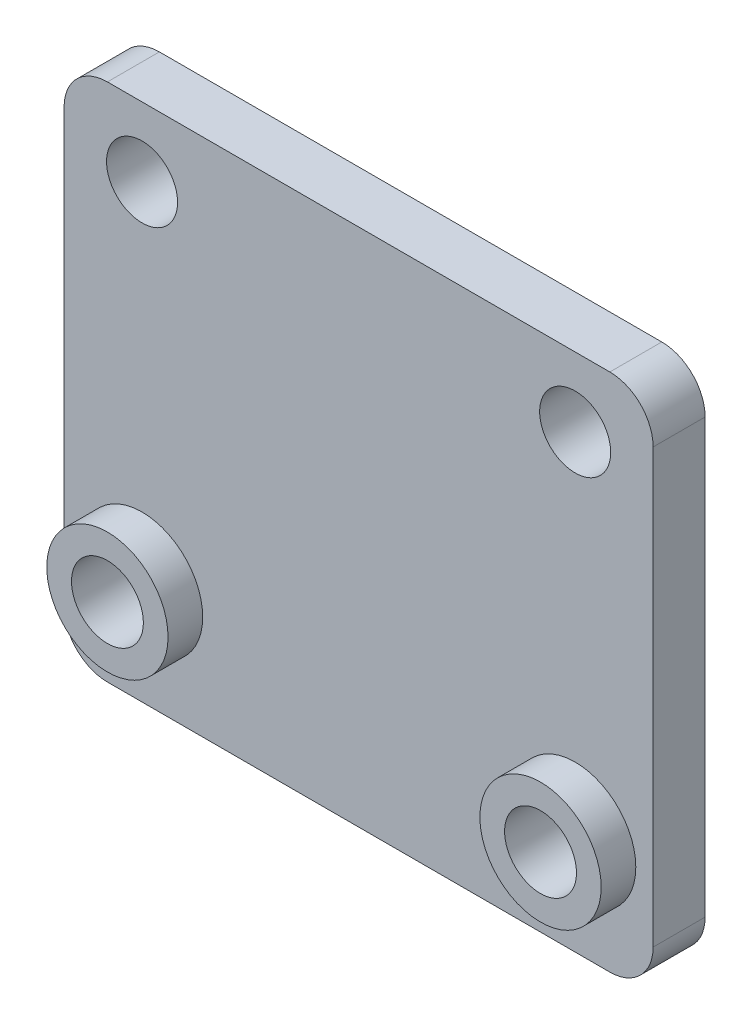
ISO-10303-21;
HEADER;
FILE_DESCRIPTION(('STEP AP214'),'2;1');
FILE_NAME('part.step','',(''),(''),'','','');
FILE_SCHEMA(('AUTOMOTIVE_DESIGN { 1 0 10303 214 1 1 1 1 }'));
ENDSEC;
DATA;
#1=APPLICATION_CONTEXT('core data for automotive mechanical design processes');
#2=APPLICATION_PROTOCOL_DEFINITION('international standard','automotive_design',2000,#1);
#3=PRODUCT_CONTEXT('',#1,'mechanical');
#4=PRODUCT('Part','Part','',(#3));
#5=PRODUCT_RELATED_PRODUCT_CATEGORY('part','',(#4));
#6=PRODUCT_DEFINITION_FORMATION('','',#4);
#7=PRODUCT_DEFINITION_CONTEXT('part definition',#1,'design');
#8=PRODUCT_DEFINITION('design','',#6,#7);
#9=PRODUCT_DEFINITION_SHAPE('','',#8);
#10=(LENGTH_UNIT() NAMED_UNIT(*) SI_UNIT(.MILLI.,.METRE.));
#11=(NAMED_UNIT(*) PLANE_ANGLE_UNIT() SI_UNIT($,.RADIAN.));
#12=(NAMED_UNIT(*) SI_UNIT($,.STERADIAN.) SOLID_ANGLE_UNIT());
#13=UNCERTAINTY_MEASURE_WITH_UNIT(LENGTH_MEASURE(1.E-05),#10,'distance_accuracy_value','');
#14=(GEOMETRIC_REPRESENTATION_CONTEXT(3) GLOBAL_UNCERTAINTY_ASSIGNED_CONTEXT((#13)) GLOBAL_UNIT_ASSIGNED_CONTEXT((#10,
#11,#12)) REPRESENTATION_CONTEXT('',''));
#15=CARTESIAN_POINT('',(0.,0.,0.));
#16=DIRECTION('',(0.,0.,1.));
#17=DIRECTION('',(1.,0.,0.));
#18=AXIS2_PLACEMENT_3D('',#15,#16,#17);
#19=CARTESIAN_POINT('',(34.,0.,136.));
#20=DIRECTION('',(-1.,0.,0.));
#21=DIRECTION('',(0.,-1.,0.));
#22=AXIS2_PLACEMENT_3D('',#19,#20,#21);
#23=PLANE('',#22);
#24=DIRECTION('',(0.,-1.,0.));
#25=VECTOR('',#24,1.);
#26=CARTESIAN_POINT('',(34.,0.,130.));
#27=LINE('',#26,#25);
#28=CARTESIAN_POINT('',(34.,25.,130.));
#29=VERTEX_POINT('',#28);
#30=CARTESIAN_POINT('',(34.,-25.,130.));
#31=VERTEX_POINT('',#30);
#32=EDGE_CURVE('E135',#29,#31,#27,.T.);
#33=ORIENTED_EDGE('',*,*,#32,.F.);
#34=DIRECTION('',(0.,0.,-1.));
#35=VECTOR('',#34,1.);
#36=CARTESIAN_POINT('',(34.,25.,136.));
#37=LINE('',#36,#35);
#38=CARTESIAN_POINT('',(34.,25.,136.));
#39=VERTEX_POINT('',#38);
#40=EDGE_CURVE('E109',#29,#39,#37,.F.);
#41=ORIENTED_EDGE('',*,*,#40,.T.);
#42=DIRECTION('',(0.,-1.,0.));
#43=VECTOR('',#42,1.);
#44=CARTESIAN_POINT('',(34.,0.,136.));
#45=LINE('',#44,#43);
#46=CARTESIAN_POINT('',(34.,-25.,136.));
#47=VERTEX_POINT('',#46);
#48=EDGE_CURVE('E160',#39,#47,#45,.T.);
#49=ORIENTED_EDGE('',*,*,#48,.T.);
#50=DIRECTION('',(0.,0.,-1.));
#51=VECTOR('',#50,1.);
#52=CARTESIAN_POINT('',(34.,-25.,136.));
#53=LINE('',#52,#51);
#54=EDGE_CURVE('E115',#47,#31,#53,.T.);
#55=ORIENTED_EDGE('',*,*,#54,.T.);
#56=EDGE_LOOP('',(#33,#41,#49,#55));
#57=FACE_BOUND('',#56,.T.);
#58=ADVANCED_FACE('F16',(#57),#23,.F.);
#59=CARTESIAN_POINT('',(0.,30.,136.));
#60=DIRECTION('',(0.,1.,0.));
#61=DIRECTION('',(-1.,0.,0.));
#62=AXIS2_PLACEMENT_3D('',#59,#60,#61);
#63=PLANE('',#62);
#64=DIRECTION('',(-1.,0.,0.));
#65=VECTOR('',#64,1.);
#66=CARTESIAN_POINT('',(0.,30.,136.));
#67=LINE('',#66,#65);
#68=CARTESIAN_POINT('',(29.,30.,136.));
#69=VERTEX_POINT('',#68);
#70=CARTESIAN_POINT('',(-29.,30.,136.));
#71=VERTEX_POINT('',#70);
#72=EDGE_CURVE('E125',#69,#71,#67,.T.);
#73=ORIENTED_EDGE('',*,*,#72,.F.);
#74=DIRECTION('',(0.,0.,-1.));
#75=VECTOR('',#74,1.);
#76=CARTESIAN_POINT('',(29.,30.,130.));
#77=LINE('',#76,#75);
#78=CARTESIAN_POINT('',(29.,30.,130.));
#79=VERTEX_POINT('',#78);
#80=EDGE_CURVE('E108',#69,#79,#77,.T.);
#81=ORIENTED_EDGE('',*,*,#80,.T.);
#82=DIRECTION('',(-1.,0.,0.));
#83=VECTOR('',#82,1.);
#84=CARTESIAN_POINT('',(0.,30.,130.));
#85=LINE('',#84,#83);
#86=CARTESIAN_POINT('',(-29.,30.,130.));
#87=VERTEX_POINT('',#86);
#88=EDGE_CURVE('E122',#79,#87,#85,.T.);
#89=ORIENTED_EDGE('',*,*,#88,.T.);
#90=DIRECTION('',(0.,0.,-1.));
#91=VECTOR('',#90,1.);
#92=CARTESIAN_POINT('',(-29.,30.,136.));
#93=LINE('',#92,#91);
#94=EDGE_CURVE('E128',#87,#71,#93,.F.);
#95=ORIENTED_EDGE('',*,*,#94,.T.);
#96=EDGE_LOOP('',(#73,#81,#89,#95));
#97=FACE_BOUND('',#96,.T.);
#98=ADVANCED_FACE('F121',(#97),#63,.T.);
#99=CARTESIAN_POINT('',(-34.,0.,136.));
#100=DIRECTION('',(-1.,0.,0.));
#101=DIRECTION('',(0.,-1.,0.));
#102=AXIS2_PLACEMENT_3D('',#99,#100,#101);
#103=PLANE('',#102);
#104=DIRECTION('',(0.,-1.,0.));
#105=VECTOR('',#104,1.);
#106=CARTESIAN_POINT('',(-34.,0.,130.));
#107=LINE('',#106,#105);
#108=CARTESIAN_POINT('',(-34.,25.,130.));
#109=VERTEX_POINT('',#108);
#110=CARTESIAN_POINT('',(-34.,-25.,130.));
#111=VERTEX_POINT('',#110);
#112=EDGE_CURVE('E134',#109,#111,#107,.T.);
#113=ORIENTED_EDGE('',*,*,#112,.T.);
#114=DIRECTION('',(0.,0.,-1.));
#115=VECTOR('',#114,1.);
#116=CARTESIAN_POINT('',(-34.,-25.,136.));
#117=LINE('',#116,#115);
#118=CARTESIAN_POINT('',(-34.,-25.,136.));
#119=VERTEX_POINT('',#118);
#120=EDGE_CURVE('E10',#111,#119,#117,.F.);
#121=ORIENTED_EDGE('',*,*,#120,.T.);
#122=DIRECTION('',(0.,-1.,0.));
#123=VECTOR('',#122,1.);
#124=CARTESIAN_POINT('',(-34.,0.,136.));
#125=LINE('',#124,#123);
#126=CARTESIAN_POINT('',(-34.,25.,136.));
#127=VERTEX_POINT('',#126);
#128=EDGE_CURVE('E203',#127,#119,#125,.T.);
#129=ORIENTED_EDGE('',*,*,#128,.F.);
#130=DIRECTION('',(0.,0.,-1.));
#131=VECTOR('',#130,1.);
#132=CARTESIAN_POINT('',(-34.,25.,136.));
#133=LINE('',#132,#131);
#134=EDGE_CURVE('E25',#127,#109,#133,.T.);
#135=ORIENTED_EDGE('',*,*,#134,.T.);
#136=EDGE_LOOP('',(#113,#121,#129,#135));
#137=FACE_BOUND('',#136,.T.);
#138=ADVANCED_FACE('F201',(#137),#103,.T.);
#139=CARTESIAN_POINT('',(-25.,22.,136.));
#140=DIRECTION('',(0.,0.,-1.));
#141=DIRECTION('',(1.,0.,0.));
#142=AXIS2_PLACEMENT_3D('',#139,#140,#141);
#143=CYLINDRICAL_SURFACE('',#142,4.1);
#144=CARTESIAN_POINT('',(-25.,22.,136.));
#145=DIRECTION('',(0.,0.,1.));
#146=DIRECTION('',(1.,0.,0.));
#147=AXIS2_PLACEMENT_3D('',#144,#145,#146);
#148=CIRCLE('',#147,4.1);
#149=CARTESIAN_POINT('',(-20.9,22.,136.));
#150=VERTEX_POINT('',#149);
#151=EDGE_CURVE('E218',#150,#150,#148,.T.);
#152=ORIENTED_EDGE('',*,*,#151,.T.);
#153=EDGE_LOOP('',(#152));
#154=FACE_BOUND('',#153,.T.);
#155=CARTESIAN_POINT('',(-25.,22.,130.));
#156=DIRECTION('',(0.,0.,1.));
#157=DIRECTION('',(1.,0.,0.));
#158=AXIS2_PLACEMENT_3D('',#155,#156,#157);
#159=CIRCLE('',#158,4.1);
#160=CARTESIAN_POINT('',(-20.9,22.,130.));
#161=VERTEX_POINT('',#160);
#162=EDGE_CURVE('E156',#161,#161,#159,.T.);
#163=ORIENTED_EDGE('',*,*,#162,.F.);
#164=EDGE_LOOP('',(#163));
#165=FACE_BOUND('',#164,.T.);
#166=ADVANCED_FACE('F368',(#154,#165),#143,.F.);
#167=CARTESIAN_POINT('',(25.,22.,136.));
#168=DIRECTION('',(0.,0.,-1.));
#169=DIRECTION('',(1.,0.,0.));
#170=AXIS2_PLACEMENT_3D('',#167,#168,#169);
#171=CYLINDRICAL_SURFACE('',#170,4.1);
#172=CARTESIAN_POINT('',(25.,22.,136.));
#173=DIRECTION('',(0.,0.,1.));
#174=DIRECTION('',(1.,0.,0.));
#175=AXIS2_PLACEMENT_3D('',#172,#173,#174);
#176=CIRCLE('',#175,4.1);
#177=CARTESIAN_POINT('',(29.1,22.,136.));
#178=VERTEX_POINT('',#177);
#179=EDGE_CURVE('E213',#178,#178,#176,.T.);
#180=ORIENTED_EDGE('',*,*,#179,.T.);
#181=EDGE_LOOP('',(#180));
#182=FACE_BOUND('',#181,.T.);
#183=CARTESIAN_POINT('',(25.,22.,130.));
#184=DIRECTION('',(0.,0.,1.));
#185=DIRECTION('',(1.,0.,0.));
#186=AXIS2_PLACEMENT_3D('',#183,#184,#185);
#187=CIRCLE('',#186,4.1);
#188=CARTESIAN_POINT('',(29.1,22.,130.));
#189=VERTEX_POINT('',#188);
#190=EDGE_CURVE('E152',#189,#189,#187,.T.);
#191=ORIENTED_EDGE('',*,*,#190,.F.);
#192=EDGE_LOOP('',(#191));
#193=FACE_BOUND('',#192,.T.);
#194=ADVANCED_FACE('F362',(#182,#193),#171,.F.);
#195=CARTESIAN_POINT('',(0.,-30.,136.));
#196=DIRECTION('',(0.,1.,0.));
#197=DIRECTION('',(-1.,0.,0.));
#198=AXIS2_PLACEMENT_3D('',#195,#196,#197);
#199=PLANE('',#198);
#200=DIRECTION('',(-1.,0.,0.));
#201=VECTOR('',#200,1.);
#202=CARTESIAN_POINT('',(0.,-30.,136.));
#203=LINE('',#202,#201);
#204=CARTESIAN_POINT('',(29.,-30.,136.));
#205=VERTEX_POINT('',#204);
#206=CARTESIAN_POINT('',(-29.,-30.,136.));
#207=VERTEX_POINT('',#206);
#208=EDGE_CURVE('E210',#205,#207,#203,.T.);
#209=ORIENTED_EDGE('',*,*,#208,.T.);
#210=DIRECTION('',(0.,0.,-1.));
#211=VECTOR('',#210,1.);
#212=CARTESIAN_POINT('',(-29.,-30.,130.));
#213=LINE('',#212,#211);
#214=CARTESIAN_POINT('',(-29.,-30.,130.));
#215=VERTEX_POINT('',#214);
#216=EDGE_CURVE('E192',#207,#215,#213,.T.);
#217=ORIENTED_EDGE('',*,*,#216,.T.);
#218=DIRECTION('',(-1.,0.,0.));
#219=VECTOR('',#218,1.);
#220=CARTESIAN_POINT('',(0.,-30.,130.));
#221=LINE('',#220,#219);
#222=CARTESIAN_POINT('',(29.,-30.,130.));
#223=VERTEX_POINT('',#222);
#224=EDGE_CURVE('E142',#223,#215,#221,.T.);
#225=ORIENTED_EDGE('',*,*,#224,.F.);
#226=DIRECTION('',(0.,0.,-1.));
#227=VECTOR('',#226,1.);
#228=CARTESIAN_POINT('',(29.,-30.,136.));
#229=LINE('',#228,#227);
#230=EDGE_CURVE('E48',#223,#205,#229,.F.);
#231=ORIENTED_EDGE('',*,*,#230,.T.);
#232=EDGE_LOOP('',(#209,#217,#225,#231));
#233=FACE_BOUND('',#232,.T.);
#234=ADVANCED_FACE('F209',(#233),#199,.F.);
#235=CARTESIAN_POINT('',(0.,0.,136.));
#236=DIRECTION('',(0.,0.,-1.));
#237=DIRECTION('',(1.,0.,0.));
#238=AXIS2_PLACEMENT_3D('',#235,#236,#237);
#239=PLANE('',#238);
#240=CARTESIAN_POINT('',(-25.,-18.,136.));
#241=DIRECTION('',(0.,0.,1.));
#242=DIRECTION('',(1.,0.,0.));
#243=AXIS2_PLACEMENT_3D('',#240,#241,#242);
#244=CIRCLE('',#243,7.);
#245=CARTESIAN_POINT('',(-18.,-18.,136.));
#246=VERTEX_POINT('',#245);
#247=EDGE_CURVE('E161',#246,#246,#244,.F.);
#248=ORIENTED_EDGE('',*,*,#247,.T.);
#249=EDGE_LOOP('',(#248));
#250=FACE_BOUND('',#249,.T.);
#251=CARTESIAN_POINT('',(25.,-18.,136.));
#252=DIRECTION('',(0.,0.,-1.));
#253=DIRECTION('',(1.,0.,0.));
#254=AXIS2_PLACEMENT_3D('',#251,#252,#253);
#255=CIRCLE('',#254,7.);
#256=CARTESIAN_POINT('',(32.,-18.,136.));
#257=VERTEX_POINT('',#256);
#258=EDGE_CURVE('E165',#257,#257,#255,.T.);
#259=ORIENTED_EDGE('',*,*,#258,.T.);
#260=EDGE_LOOP('',(#259));
#261=FACE_BOUND('',#260,.T.);
#262=ORIENTED_EDGE('',*,*,#48,.F.);
#263=CARTESIAN_POINT('',(29.,25.,136.));
#264=DIRECTION('',(0.,0.,-1.));
#265=DIRECTION('',(-1.,0.,0.));
#266=AXIS2_PLACEMENT_3D('',#263,#264,#265);
#267=CIRCLE('',#266,5.);
#268=EDGE_CURVE('E187',#39,#69,#267,.F.);
#269=ORIENTED_EDGE('',*,*,#268,.T.);
#270=ORIENTED_EDGE('',*,*,#72,.T.);
#271=CARTESIAN_POINT('',(-29.,25.,136.));
#272=DIRECTION('',(0.,0.,-1.));
#273=DIRECTION('',(-1.,0.,0.));
#274=AXIS2_PLACEMENT_3D('',#271,#272,#273);
#275=CIRCLE('',#274,5.);
#276=EDGE_CURVE('E180',#71,#127,#275,.F.);
#277=ORIENTED_EDGE('',*,*,#276,.T.);
#278=ORIENTED_EDGE('',*,*,#128,.T.);
#279=CARTESIAN_POINT('',(-29.,-25.,136.));
#280=DIRECTION('',(0.,0.,-1.));
#281=DIRECTION('',(-1.,0.,0.));
#282=AXIS2_PLACEMENT_3D('',#279,#280,#281);
#283=CIRCLE('',#282,5.);
#284=EDGE_CURVE('E37',#119,#207,#283,.F.);
#285=ORIENTED_EDGE('',*,*,#284,.T.);
#286=ORIENTED_EDGE('',*,*,#208,.F.);
#287=CARTESIAN_POINT('',(29.,-25.,136.));
#288=DIRECTION('',(0.,0.,-1.));
#289=DIRECTION('',(-1.,0.,0.));
#290=AXIS2_PLACEMENT_3D('',#287,#288,#289);
#291=CIRCLE('',#290,5.);
#292=EDGE_CURVE('E183',#205,#47,#291,.F.);
#293=ORIENTED_EDGE('',*,*,#292,.T.);
#294=EDGE_LOOP('',(#262,#269,#270,#277,#278,#285,#286,#293));
#295=FACE_BOUND('',#294,.T.);
#296=ORIENTED_EDGE('',*,*,#179,.F.);
#297=EDGE_LOOP('',(#296));
#298=FACE_BOUND('',#297,.T.);
#299=ORIENTED_EDGE('',*,*,#151,.F.);
#300=EDGE_LOOP('',(#299));
#301=FACE_BOUND('',#300,.T.);
#302=ADVANCED_FACE('F250',(#250,#261,#295,#298,#301),#239,.F.);
#303=CARTESIAN_POINT('',(0.,0.,130.));
#304=DIRECTION('',(0.,0.,-1.));
#305=DIRECTION('',(1.,0.,0.));
#306=AXIS2_PLACEMENT_3D('',#303,#304,#305);
#307=PLANE('',#306);
#308=ORIENTED_EDGE('',*,*,#88,.F.);
#309=CARTESIAN_POINT('',(29.,25.,130.));
#310=DIRECTION('',(0.,0.,-1.));
#311=DIRECTION('',(-1.,0.,0.));
#312=AXIS2_PLACEMENT_3D('',#309,#310,#311);
#313=CIRCLE('',#312,5.);
#314=EDGE_CURVE('E104',#79,#29,#313,.T.);
#315=ORIENTED_EDGE('',*,*,#314,.T.);
#316=ORIENTED_EDGE('',*,*,#32,.T.);
#317=CARTESIAN_POINT('',(29.,-25.,130.));
#318=DIRECTION('',(0.,0.,-1.));
#319=DIRECTION('',(-1.,0.,0.));
#320=AXIS2_PLACEMENT_3D('',#317,#318,#319);
#321=CIRCLE('',#320,5.);
#322=EDGE_CURVE('E170',#31,#223,#321,.T.);
#323=ORIENTED_EDGE('',*,*,#322,.T.);
#324=ORIENTED_EDGE('',*,*,#224,.T.);
#325=CARTESIAN_POINT('',(-29.,-25.,130.));
#326=DIRECTION('',(0.,0.,-1.));
#327=DIRECTION('',(-1.,0.,0.));
#328=AXIS2_PLACEMENT_3D('',#325,#326,#327);
#329=CIRCLE('',#328,5.);
#330=EDGE_CURVE('E116',#215,#111,#329,.T.);
#331=ORIENTED_EDGE('',*,*,#330,.T.);
#332=ORIENTED_EDGE('',*,*,#112,.F.);
#333=CARTESIAN_POINT('',(-29.,25.,130.));
#334=DIRECTION('',(0.,0.,-1.));
#335=DIRECTION('',(-1.,0.,0.));
#336=AXIS2_PLACEMENT_3D('',#333,#334,#335);
#337=CIRCLE('',#336,5.);
#338=EDGE_CURVE('E127',#109,#87,#337,.T.);
#339=ORIENTED_EDGE('',*,*,#338,.T.);
#340=EDGE_LOOP('',(#308,#315,#316,#323,#324,#331,#332,#339));
#341=FACE_BOUND('',#340,.T.);
#342=ORIENTED_EDGE('',*,*,#190,.T.);
#343=EDGE_LOOP('',(#342));
#344=FACE_BOUND('',#343,.T.);
#345=ORIENTED_EDGE('',*,*,#162,.T.);
#346=EDGE_LOOP('',(#345));
#347=FACE_BOUND('',#346,.T.);
#348=ADVANCED_FACE('F130',(#341,#344,#347),#307,.T.);
#349=CARTESIAN_POINT('',(25.,-18.,140.));
#350=DIRECTION('',(0.,0.,-1.));
#351=DIRECTION('',(1.,0.,0.));
#352=AXIS2_PLACEMENT_3D('',#349,#350,#351);
#353=CYLINDRICAL_SURFACE('',#352,7.);
#354=CARTESIAN_POINT('',(25.,-18.,140.));
#355=DIRECTION('',(0.,0.,-1.));
#356=DIRECTION('',(1.,0.,0.));
#357=AXIS2_PLACEMENT_3D('',#354,#355,#356);
#358=CIRCLE('',#357,7.);
#359=CARTESIAN_POINT('',(32.,-18.,140.));
#360=VERTEX_POINT('',#359);
#361=EDGE_CURVE('E238',#360,#360,#358,.T.);
#362=ORIENTED_EDGE('',*,*,#361,.T.);
#363=EDGE_LOOP('',(#362));
#364=FACE_BOUND('',#363,.T.);
#365=ORIENTED_EDGE('',*,*,#258,.F.);
#366=EDGE_LOOP('',(#365));
#367=FACE_BOUND('',#366,.T.);
#368=ADVANCED_FACE('F338',(#364,#367),#353,.T.);
#369=CARTESIAN_POINT('',(0.,0.,140.));
#370=DIRECTION('',(0.,0.,1.));
#371=DIRECTION('',(1.,0.,0.));
#372=AXIS2_PLACEMENT_3D('',#369,#370,#371);
#373=PLANE('',#372);
#374=CARTESIAN_POINT('',(25.,-18.,140.));
#375=DIRECTION('',(0.,0.,1.));
#376=DIRECTION('',(1.,0.,0.));
#377=AXIS2_PLACEMENT_3D('',#374,#375,#376);
#378=CIRCLE('',#377,4.15);
#379=CARTESIAN_POINT('',(29.15,-18.,140.));
#380=VERTEX_POINT('',#379);
#381=EDGE_CURVE('E396',#380,#380,#378,.T.);
#382=ORIENTED_EDGE('',*,*,#381,.F.);
#383=EDGE_LOOP('',(#382));
#384=FACE_BOUND('',#383,.T.);
#385=ORIENTED_EDGE('',*,*,#361,.F.);
#386=EDGE_LOOP('',(#385));
#387=FACE_BOUND('',#386,.T.);
#388=ADVANCED_FACE('F331',(#384,#387),#373,.T.);
#389=CARTESIAN_POINT('',(0.,-18.,132.));
#390=DIRECTION('',(0.,0.,1.));
#391=DIRECTION('',(1.,0.,0.));
#392=AXIS2_PLACEMENT_3D('',#389,#390,#391);
#393=PLANE('',#392);
#394=CARTESIAN_POINT('',(25.,-18.,132.));
#395=DIRECTION('',(0.,0.,1.));
#396=DIRECTION('',(-1.,0.,0.));
#397=AXIS2_PLACEMENT_3D('',#394,#395,#396);
#398=CIRCLE('',#397,4.15);
#399=CARTESIAN_POINT('',(20.85,-18.,132.));
#400=VERTEX_POINT('',#399);
#401=EDGE_CURVE('E145',#400,#400,#398,.T.);
#402=ORIENTED_EDGE('',*,*,#401,.T.);
#403=EDGE_LOOP('',(#402));
#404=FACE_BOUND('',#403,.T.);
#405=ADVANCED_FACE('F325',(#404),#393,.T.);
#406=CARTESIAN_POINT('',(25.,-18.,157.));
#407=DIRECTION('',(0.,0.,-1.));
#408=DIRECTION('',(1.,0.,0.));
#409=AXIS2_PLACEMENT_3D('',#406,#407,#408);
#410=CYLINDRICAL_SURFACE('',#409,4.15);
#411=ORIENTED_EDGE('',*,*,#401,.F.);
#412=EDGE_LOOP('',(#411));
#413=FACE_BOUND('',#412,.T.);
#414=ORIENTED_EDGE('',*,*,#381,.T.);
#415=EDGE_LOOP('',(#414));
#416=FACE_BOUND('',#415,.T.);
#417=ADVANCED_FACE('F318',(#413,#416),#410,.F.);
#418=CARTESIAN_POINT('',(-25.,-18.,140.));
#419=DIRECTION('',(0.,0.,-1.));
#420=DIRECTION('',(1.,0.,0.));
#421=AXIS2_PLACEMENT_3D('',#418,#419,#420);
#422=CYLINDRICAL_SURFACE('',#421,7.);
#423=CARTESIAN_POINT('',(-25.,-18.,140.));
#424=DIRECTION('',(0.,0.,-1.));
#425=DIRECTION('',(1.,0.,0.));
#426=AXIS2_PLACEMENT_3D('',#423,#424,#425);
#427=CIRCLE('',#426,7.);
#428=CARTESIAN_POINT('',(-18.,-18.,140.));
#429=VERTEX_POINT('',#428);
#430=EDGE_CURVE('E406',#429,#429,#427,.T.);
#431=ORIENTED_EDGE('',*,*,#430,.T.);
#432=EDGE_LOOP('',(#431));
#433=FACE_BOUND('',#432,.T.);
#434=ORIENTED_EDGE('',*,*,#247,.F.);
#435=EDGE_LOOP('',(#434));
#436=FACE_BOUND('',#435,.T.);
#437=ADVANCED_FACE('F311',(#433,#436),#422,.T.);
#438=CARTESIAN_POINT('',(0.,0.,140.));
#439=DIRECTION('',(0.,0.,1.));
#440=DIRECTION('',(1.,0.,0.));
#441=AXIS2_PLACEMENT_3D('',#438,#439,#440);
#442=PLANE('',#441);
#443=CARTESIAN_POINT('',(-25.,-18.,140.));
#444=DIRECTION('',(0.,0.,1.));
#445=DIRECTION('',(1.,0.,0.));
#446=AXIS2_PLACEMENT_3D('',#443,#444,#445);
#447=CIRCLE('',#446,4.15);
#448=CARTESIAN_POINT('',(-20.85,-18.,140.));
#449=VERTEX_POINT('',#448);
#450=EDGE_CURVE('E401',#449,#449,#447,.T.);
#451=ORIENTED_EDGE('',*,*,#450,.F.);
#452=EDGE_LOOP('',(#451));
#453=FACE_BOUND('',#452,.T.);
#454=ORIENTED_EDGE('',*,*,#430,.F.);
#455=EDGE_LOOP('',(#454));
#456=FACE_BOUND('',#455,.T.);
#457=ADVANCED_FACE('F302',(#453,#456),#442,.T.);
#458=CARTESIAN_POINT('',(0.,-18.,132.));
#459=DIRECTION('',(0.,0.,1.));
#460=DIRECTION('',(1.,0.,0.));
#461=AXIS2_PLACEMENT_3D('',#458,#459,#460);
#462=PLANE('',#461);
#463=CARTESIAN_POINT('',(-25.,-18.,132.));
#464=DIRECTION('',(0.,0.,1.));
#465=DIRECTION('',(-1.,0.,0.));
#466=AXIS2_PLACEMENT_3D('',#463,#464,#465);
#467=CIRCLE('',#466,4.15);
#468=CARTESIAN_POINT('',(-29.15,-18.,132.));
#469=VERTEX_POINT('',#468);
#470=EDGE_CURVE('E242',#469,#469,#467,.T.);
#471=ORIENTED_EDGE('',*,*,#470,.T.);
#472=EDGE_LOOP('',(#471));
#473=FACE_BOUND('',#472,.T.);
#474=ADVANCED_FACE('F294',(#473),#462,.T.);
#475=CARTESIAN_POINT('',(-25.,-18.,157.));
#476=DIRECTION('',(0.,0.,-1.));
#477=DIRECTION('',(1.,0.,0.));
#478=AXIS2_PLACEMENT_3D('',#475,#476,#477);
#479=CYLINDRICAL_SURFACE('',#478,4.15);
#480=ORIENTED_EDGE('',*,*,#470,.F.);
#481=EDGE_LOOP('',(#480));
#482=FACE_BOUND('',#481,.T.);
#483=ORIENTED_EDGE('',*,*,#450,.T.);
#484=EDGE_LOOP('',(#483));
#485=FACE_BOUND('',#484,.T.);
#486=ADVANCED_FACE('F270',(#482,#485),#479,.F.);
#487=CARTESIAN_POINT('',(29.,25.,136.));
#488=DIRECTION('',(0.,0.,1.));
#489=DIRECTION('',(1.,0.,0.));
#490=AXIS2_PLACEMENT_3D('',#487,#488,#489);
#491=CYLINDRICAL_SURFACE('',#490,5.);
#492=ORIENTED_EDGE('',*,*,#268,.F.);
#493=ORIENTED_EDGE('',*,*,#40,.F.);
#494=ORIENTED_EDGE('',*,*,#314,.F.);
#495=ORIENTED_EDGE('',*,*,#80,.F.);
#496=EDGE_LOOP('',(#492,#493,#494,#495));
#497=FACE_BOUND('',#496,.T.);
#498=ADVANCED_FACE('F107',(#497),#491,.T.);
#499=CARTESIAN_POINT('',(-29.,-25.,136.));
#500=DIRECTION('',(0.,0.,1.));
#501=DIRECTION('',(1.,0.,0.));
#502=AXIS2_PLACEMENT_3D('',#499,#500,#501);
#503=CYLINDRICAL_SURFACE('',#502,5.);
#504=ORIENTED_EDGE('',*,*,#284,.F.);
#505=ORIENTED_EDGE('',*,*,#120,.F.);
#506=ORIENTED_EDGE('',*,*,#330,.F.);
#507=ORIENTED_EDGE('',*,*,#216,.F.);
#508=EDGE_LOOP('',(#504,#505,#506,#507));
#509=FACE_BOUND('',#508,.T.);
#510=ADVANCED_FACE('F208',(#509),#503,.T.);
#511=CARTESIAN_POINT('',(29.,-25.,136.));
#512=DIRECTION('',(0.,0.,-1.));
#513=DIRECTION('',(-1.,0.,0.));
#514=AXIS2_PLACEMENT_3D('',#511,#512,#513);
#515=CYLINDRICAL_SURFACE('',#514,5.);
#516=ORIENTED_EDGE('',*,*,#292,.F.);
#517=ORIENTED_EDGE('',*,*,#230,.F.);
#518=ORIENTED_EDGE('',*,*,#322,.F.);
#519=ORIENTED_EDGE('',*,*,#54,.F.);
#520=EDGE_LOOP('',(#516,#517,#518,#519));
#521=FACE_BOUND('',#520,.T.);
#522=ADVANCED_FACE('F253',(#521),#515,.T.);
#523=CARTESIAN_POINT('',(-29.,25.,136.));
#524=DIRECTION('',(0.,0.,-1.));
#525=DIRECTION('',(-1.,0.,0.));
#526=AXIS2_PLACEMENT_3D('',#523,#524,#525);
#527=CYLINDRICAL_SURFACE('',#526,5.);
#528=ORIENTED_EDGE('',*,*,#276,.F.);
#529=ORIENTED_EDGE('',*,*,#94,.F.);
#530=ORIENTED_EDGE('',*,*,#338,.F.);
#531=ORIENTED_EDGE('',*,*,#134,.F.);
#532=EDGE_LOOP('',(#528,#529,#530,#531));
#533=FACE_BOUND('',#532,.T.);
#534=ADVANCED_FACE('F18',(#533),#527,.T.);
#535=CLOSED_SHELL('',(#58,#98,#138,#166,#194,#234,#302,#348,#368,#388,#405,#417,#437,#457,#474,
#486,#498,#510,#522,#534));
#536=MANIFOLD_SOLID_BREP('B1',#535);
#537=ADVANCED_BREP_SHAPE_REPRESENTATION('',(#18,#536),#14);
#538=SHAPE_DEFINITION_REPRESENTATION(#9,#537);
ENDSEC;
END-ISO-10303-21;
